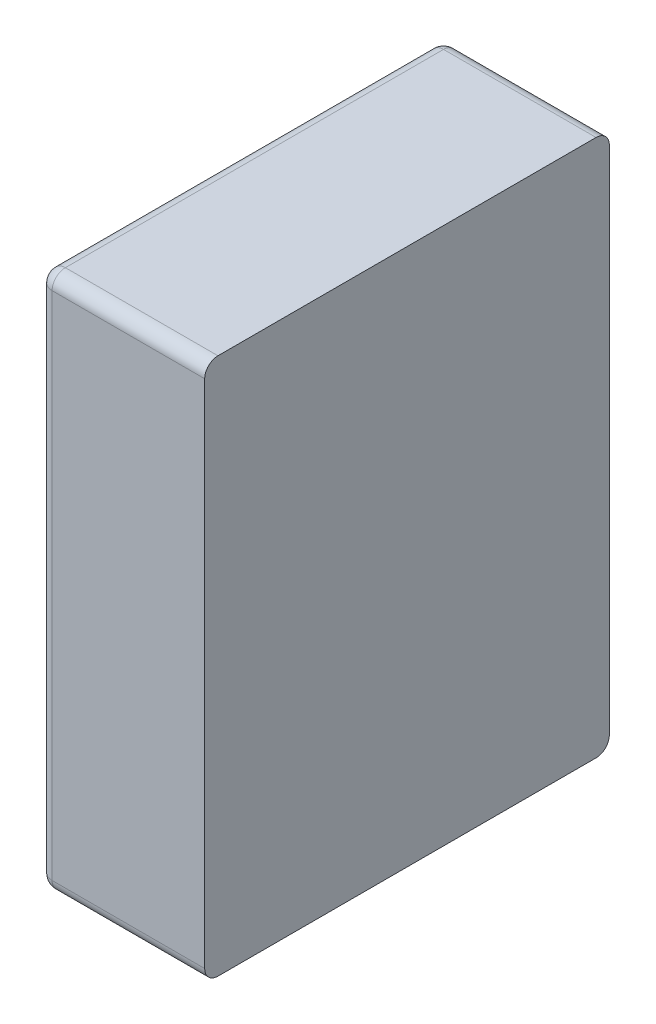
ISO-10303-21;
HEADER;
FILE_DESCRIPTION(('STEP AP214'),'2;1');
FILE_NAME('part.step','',(''),(''),'','','');
FILE_SCHEMA(('AUTOMOTIVE_DESIGN { 1 0 10303 214 1 1 1 1 }'));
ENDSEC;
DATA;
#1=APPLICATION_CONTEXT('core data for automotive mechanical design processes');
#2=APPLICATION_PROTOCOL_DEFINITION('international standard','automotive_design',2000,#1);
#3=PRODUCT_CONTEXT('',#1,'mechanical');
#4=PRODUCT('Part','Part','',(#3));
#5=PRODUCT_RELATED_PRODUCT_CATEGORY('part','',(#4));
#6=PRODUCT_DEFINITION_FORMATION('','',#4);
#7=PRODUCT_DEFINITION_CONTEXT('part definition',#1,'design');
#8=PRODUCT_DEFINITION('design','',#6,#7);
#9=PRODUCT_DEFINITION_SHAPE('','',#8);
#10=(LENGTH_UNIT() NAMED_UNIT(*) SI_UNIT(.MILLI.,.METRE.));
#11=(NAMED_UNIT(*) PLANE_ANGLE_UNIT() SI_UNIT($,.RADIAN.));
#12=(NAMED_UNIT(*) SI_UNIT($,.STERADIAN.) SOLID_ANGLE_UNIT());
#13=UNCERTAINTY_MEASURE_WITH_UNIT(LENGTH_MEASURE(1.E-05),#10,'distance_accuracy_value','');
#14=(GEOMETRIC_REPRESENTATION_CONTEXT(3) GLOBAL_UNCERTAINTY_ASSIGNED_CONTEXT((#13)) GLOBAL_UNIT_ASSIGNED_CONTEXT((#10,
#11,#12)) REPRESENTATION_CONTEXT('',''));
#15=CARTESIAN_POINT('',(0.,0.,0.));
#16=DIRECTION('',(0.,0.,1.));
#17=DIRECTION('',(1.,0.,0.));
#18=AXIS2_PLACEMENT_3D('',#15,#16,#17);
#19=CARTESIAN_POINT('',(-1.56,0.77,1.17));
#20=DIRECTION('',(0.,1.,0.));
#21=DIRECTION('',(1.,0.,0.));
#22=AXIS2_PLACEMENT_3D('',#19,#20,#21);
#23=SPHERICAL_SURFACE('',#22,0.04);
#24=CARTESIAN_POINT('',(-1.56,0.77,1.17));
#25=DIRECTION('',(0.,0.,1.));
#26=DIRECTION('',(0.,1.,0.));
#27=AXIS2_PLACEMENT_3D('',#24,#25,#26);
#28=CIRCLE('',#27,0.04);
#29=CARTESIAN_POINT('',(-1.56,0.81,1.17));
#30=VERTEX_POINT('',#29);
#31=CARTESIAN_POINT('',(-1.6,0.77,1.17));
#32=VERTEX_POINT('',#31);
#33=EDGE_CURVE('E41',#30,#32,#28,.T.);
#34=ORIENTED_EDGE('',*,*,#33,.T.);
#35=CARTESIAN_POINT('',(-1.56,0.77,1.17));
#36=DIRECTION('',(0.,1.,0.));
#37=DIRECTION('',(-1.,0.,0.));
#38=AXIS2_PLACEMENT_3D('',#35,#36,#37);
#39=CIRCLE('',#38,0.04);
#40=CARTESIAN_POINT('',(-1.56,0.77,1.21));
#41=VERTEX_POINT('',#40);
#42=EDGE_CURVE('E224',#32,#41,#39,.T.);
#43=ORIENTED_EDGE('',*,*,#42,.T.);
#44=CARTESIAN_POINT('',(-1.56,0.77,1.17));
#45=DIRECTION('',(-1.,0.,0.));
#46=DIRECTION('',(0.,0.,1.));
#47=AXIS2_PLACEMENT_3D('',#44,#45,#46);
#48=CIRCLE('',#47,0.04);
#49=EDGE_CURVE('E11',#41,#30,#48,.T.);
#50=ORIENTED_EDGE('',*,*,#49,.T.);
#51=EDGE_LOOP('',(#34,#43,#50));
#52=FACE_BOUND('',#51,.T.);
#53=ADVANCED_FACE('F17',(#52),#23,.T.);
#54=CARTESIAN_POINT('',(-1.6,0.77,1.17));
#55=DIRECTION('',(1.,0.,0.));
#56=DIRECTION('',(0.,1.,0.));
#57=AXIS2_PLACEMENT_3D('',#54,#55,#56);
#58=CYLINDRICAL_SURFACE('',#57,0.04);
#59=DIRECTION('',(-1.,0.,0.));
#60=VECTOR('',#59,1.);
#61=CARTESIAN_POINT('',(-1.1,0.81,1.17));
#62=LINE('',#61,#60);
#63=CARTESIAN_POINT('',(-1.1,0.81,1.17));
#64=VERTEX_POINT('',#63);
#65=EDGE_CURVE('E25',#64,#30,#62,.T.);
#66=ORIENTED_EDGE('',*,*,#65,.T.);
#67=ORIENTED_EDGE('',*,*,#49,.F.);
#68=DIRECTION('',(1.,0.,0.));
#69=VECTOR('',#68,1.);
#70=CARTESIAN_POINT('',(-1.56,0.77,1.21));
#71=LINE('',#70,#69);
#72=CARTESIAN_POINT('',(-1.1,0.77,1.21));
#73=VERTEX_POINT('',#72);
#74=EDGE_CURVE('E225',#41,#73,#71,.T.);
#75=ORIENTED_EDGE('',*,*,#74,.T.);
#76=CARTESIAN_POINT('',(-1.1,0.77,1.17));
#77=DIRECTION('',(1.,0.,0.));
#78=DIRECTION('',(0.,1.,0.));
#79=AXIS2_PLACEMENT_3D('',#76,#77,#78);
#80=CIRCLE('',#79,0.04);
#81=EDGE_CURVE('E219',#64,#73,#80,.T.);
#82=ORIENTED_EDGE('',*,*,#81,.F.);
#83=EDGE_LOOP('',(#66,#67,#75,#82));
#84=FACE_BOUND('',#83,.T.);
#85=ADVANCED_FACE('F262',(#84),#58,.T.);
#86=CARTESIAN_POINT('',(-1.6,0.81,1.21));
#87=DIRECTION('',(0.,-1.,0.));
#88=DIRECTION('',(0.,0.,-1.));
#89=AXIS2_PLACEMENT_3D('',#86,#87,#88);
#90=PLANE('',#89);
#91=DIRECTION('',(0.,0.,1.));
#92=VECTOR('',#91,1.);
#93=CARTESIAN_POINT('',(-1.1,0.81,0.03));
#94=LINE('',#93,#92);
#95=CARTESIAN_POINT('',(-1.1,0.81,0.03));
#96=VERTEX_POINT('',#95);
#97=EDGE_CURVE('E215',#96,#64,#94,.T.);
#98=ORIENTED_EDGE('',*,*,#97,.F.);
#99=DIRECTION('',(1.,0.,0.));
#100=VECTOR('',#99,1.);
#101=CARTESIAN_POINT('',(-1.56,0.81,0.03));
#102=LINE('',#101,#100);
#103=CARTESIAN_POINT('',(-1.56,0.81,0.03));
#104=VERTEX_POINT('',#103);
#105=EDGE_CURVE('E203',#104,#96,#102,.T.);
#106=ORIENTED_EDGE('',*,*,#105,.F.);
#107=DIRECTION('',(0.,0.,-1.));
#108=VECTOR('',#107,1.);
#109=CARTESIAN_POINT('',(-1.56,0.81,1.17));
#110=LINE('',#109,#108);
#111=EDGE_CURVE('E254',#30,#104,#110,.T.);
#112=ORIENTED_EDGE('',*,*,#111,.F.);
#113=ORIENTED_EDGE('',*,*,#65,.F.);
#114=EDGE_LOOP('',(#98,#106,#112,#113));
#115=FACE_BOUND('',#114,.T.);
#116=ADVANCED_FACE('F265',(#115),#90,.F.);
#117=CARTESIAN_POINT('',(-1.56,0.77,0.));
#118=DIRECTION('',(0.,0.,1.));
#119=DIRECTION('',(1.,0.,0.));
#120=AXIS2_PLACEMENT_3D('',#117,#118,#119);
#121=CYLINDRICAL_SURFACE('',#120,0.04);
#122=DIRECTION('',(0.,0.,1.));
#123=VECTOR('',#122,1.);
#124=CARTESIAN_POINT('',(-1.6,0.77,0.03));
#125=LINE('',#124,#123);
#126=CARTESIAN_POINT('',(-1.6,0.77,0.03));
#127=VERTEX_POINT('',#126);
#128=EDGE_CURVE('E249',#127,#32,#125,.T.);
#129=ORIENTED_EDGE('',*,*,#128,.T.);
#130=ORIENTED_EDGE('',*,*,#33,.F.);
#131=ORIENTED_EDGE('',*,*,#111,.T.);
#132=CARTESIAN_POINT('',(-1.56,0.77,0.03));
#133=DIRECTION('',(0.,0.,-1.));
#134=DIRECTION('',(-1.,0.,0.));
#135=AXIS2_PLACEMENT_3D('',#132,#133,#134);
#136=CIRCLE('',#135,0.04);
#137=EDGE_CURVE('E183',#127,#104,#136,.T.);
#138=ORIENTED_EDGE('',*,*,#137,.F.);
#139=EDGE_LOOP('',(#129,#130,#131,#138));
#140=FACE_BOUND('',#139,.T.);
#141=ADVANCED_FACE('F269',(#140),#121,.T.);
#142=CARTESIAN_POINT('',(-1.6,0.,0.));
#143=DIRECTION('',(-1.,0.,0.));
#144=DIRECTION('',(0.,0.,1.));
#145=AXIS2_PLACEMENT_3D('',#142,#143,#144);
#146=PLANE('',#145);
#147=DIRECTION('',(0.,0.,-1.));
#148=VECTOR('',#147,1.);
#149=CARTESIAN_POINT('',(-1.6,-0.77,1.17));
#150=LINE('',#149,#148);
#151=CARTESIAN_POINT('',(-1.6,-0.77,1.17));
#152=VERTEX_POINT('',#151);
#153=CARTESIAN_POINT('',(-1.6,-0.77,0.03));
#154=VERTEX_POINT('',#153);
#155=EDGE_CURVE('E142',#152,#154,#150,.T.);
#156=ORIENTED_EDGE('',*,*,#155,.F.);
#157=DIRECTION('',(0.,-1.,0.));
#158=VECTOR('',#157,1.);
#159=CARTESIAN_POINT('',(-1.6,0.77,1.17));
#160=LINE('',#159,#158);
#161=EDGE_CURVE('E246',#32,#152,#160,.T.);
#162=ORIENTED_EDGE('',*,*,#161,.F.);
#163=ORIENTED_EDGE('',*,*,#128,.F.);
#164=DIRECTION('',(0.,1.,0.));
#165=VECTOR('',#164,1.);
#166=CARTESIAN_POINT('',(-1.6,-0.77,0.03));
#167=LINE('',#166,#165);
#168=EDGE_CURVE('E178',#154,#127,#167,.T.);
#169=ORIENTED_EDGE('',*,*,#168,.F.);
#170=EDGE_LOOP('',(#156,#162,#163,#169));
#171=FACE_BOUND('',#170,.T.);
#172=ADVANCED_FACE('F274',(#171),#146,.T.);
#173=CARTESIAN_POINT('',(-1.56,0.,1.17));
#174=DIRECTION('',(0.,-1.,0.));
#175=DIRECTION('',(1.,0.,0.));
#176=AXIS2_PLACEMENT_3D('',#173,#174,#175);
#177=CYLINDRICAL_SURFACE('',#176,0.04);
#178=DIRECTION('',(0.,1.,0.));
#179=VECTOR('',#178,1.);
#180=CARTESIAN_POINT('',(-1.56,-0.77,1.21));
#181=LINE('',#180,#179);
#182=CARTESIAN_POINT('',(-1.56,-0.77,1.21));
#183=VERTEX_POINT('',#182);
#184=EDGE_CURVE('E220',#183,#41,#181,.T.);
#185=ORIENTED_EDGE('',*,*,#184,.T.);
#186=ORIENTED_EDGE('',*,*,#42,.F.);
#187=ORIENTED_EDGE('',*,*,#161,.T.);
#188=CARTESIAN_POINT('',(-1.56,-0.77,1.17));
#189=DIRECTION('',(0.,-1.,0.));
#190=DIRECTION('',(0.,0.,1.));
#191=AXIS2_PLACEMENT_3D('',#188,#189,#190);
#192=CIRCLE('',#191,0.04);
#193=EDGE_CURVE('E149',#183,#152,#192,.T.);
#194=ORIENTED_EDGE('',*,*,#193,.F.);
#195=EDGE_LOOP('',(#185,#186,#187,#194));
#196=FACE_BOUND('',#195,.T.);
#197=ADVANCED_FACE('F276',(#196),#177,.T.);
#198=CARTESIAN_POINT('',(-1.6,-0.81,1.21));
#199=DIRECTION('',(0.,0.,-1.));
#200=DIRECTION('',(0.,-1.,0.));
#201=AXIS2_PLACEMENT_3D('',#198,#199,#200);
#202=PLANE('',#201);
#203=DIRECTION('',(0.,-1.,0.));
#204=VECTOR('',#203,1.);
#205=CARTESIAN_POINT('',(-1.1,0.77,1.21));
#206=LINE('',#205,#204);
#207=CARTESIAN_POINT('',(-1.1,-0.77,1.21));
#208=VERTEX_POINT('',#207);
#209=EDGE_CURVE('E177',#73,#208,#206,.T.);
#210=ORIENTED_EDGE('',*,*,#209,.F.);
#211=ORIENTED_EDGE('',*,*,#74,.F.);
#212=ORIENTED_EDGE('',*,*,#184,.F.);
#213=DIRECTION('',(-1.,0.,0.));
#214=VECTOR('',#213,1.);
#215=CARTESIAN_POINT('',(-1.1,-0.77,1.21));
#216=LINE('',#215,#214);
#217=EDGE_CURVE('E128',#208,#183,#216,.T.);
#218=ORIENTED_EDGE('',*,*,#217,.F.);
#219=EDGE_LOOP('',(#210,#211,#212,#218));
#220=FACE_BOUND('',#219,.T.);
#221=ADVANCED_FACE('F290',(#220),#202,.F.);
#222=CARTESIAN_POINT('',(-1.6,-0.77,1.17));
#223=DIRECTION('',(1.,0.,0.));
#224=DIRECTION('',(0.,1.,0.));
#225=AXIS2_PLACEMENT_3D('',#222,#223,#224);
#226=CYLINDRICAL_SURFACE('',#225,0.04);
#227=ORIENTED_EDGE('',*,*,#217,.T.);
#228=CARTESIAN_POINT('',(-1.56,-0.77,1.17));
#229=DIRECTION('',(-1.,0.,0.));
#230=DIRECTION('',(0.,-1.,0.));
#231=AXIS2_PLACEMENT_3D('',#228,#229,#230);
#232=CIRCLE('',#231,0.04);
#233=CARTESIAN_POINT('',(-1.56,-0.81,1.17));
#234=VERTEX_POINT('',#233);
#235=EDGE_CURVE('E147',#234,#183,#232,.T.);
#236=ORIENTED_EDGE('',*,*,#235,.F.);
#237=DIRECTION('',(1.,0.,0.));
#238=VECTOR('',#237,1.);
#239=CARTESIAN_POINT('',(-1.56,-0.81,1.17));
#240=LINE('',#239,#238);
#241=CARTESIAN_POINT('',(-1.1,-0.81,1.17));
#242=VERTEX_POINT('',#241);
#243=EDGE_CURVE('E117',#234,#242,#240,.T.);
#244=ORIENTED_EDGE('',*,*,#243,.T.);
#245=CARTESIAN_POINT('',(-1.1,-0.77,1.17));
#246=DIRECTION('',(1.,0.,0.));
#247=DIRECTION('',(0.,0.,1.));
#248=AXIS2_PLACEMENT_3D('',#245,#246,#247);
#249=CIRCLE('',#248,0.04);
#250=EDGE_CURVE('E165',#208,#242,#249,.T.);
#251=ORIENTED_EDGE('',*,*,#250,.F.);
#252=EDGE_LOOP('',(#227,#236,#244,#251));
#253=FACE_BOUND('',#252,.T.);
#254=ADVANCED_FACE('F153',(#253),#226,.T.);
#255=CARTESIAN_POINT('',(-1.6,-0.81,-0.01));
#256=DIRECTION('',(0.,1.,0.));
#257=DIRECTION('',(1.,0.,0.));
#258=AXIS2_PLACEMENT_3D('',#255,#256,#257);
#259=PLANE('',#258);
#260=DIRECTION('',(0.,0.,1.));
#261=VECTOR('',#260,1.);
#262=CARTESIAN_POINT('',(-1.56,-0.81,0.03));
#263=LINE('',#262,#261);
#264=CARTESIAN_POINT('',(-1.56,-0.81,0.03));
#265=VERTEX_POINT('',#264);
#266=EDGE_CURVE('E120',#265,#234,#263,.T.);
#267=ORIENTED_EDGE('',*,*,#266,.F.);
#268=DIRECTION('',(-1.,0.,0.));
#269=VECTOR('',#268,1.);
#270=CARTESIAN_POINT('',(-1.1,-0.81,0.03));
#271=LINE('',#270,#269);
#272=CARTESIAN_POINT('',(-1.1,-0.81,0.03));
#273=VERTEX_POINT('',#272);
#274=EDGE_CURVE('E129',#273,#265,#271,.T.);
#275=ORIENTED_EDGE('',*,*,#274,.F.);
#276=DIRECTION('',(0.,0.,-1.));
#277=VECTOR('',#276,1.);
#278=CARTESIAN_POINT('',(-1.1,-0.81,1.17));
#279=LINE('',#278,#277);
#280=EDGE_CURVE('E122',#242,#273,#279,.T.);
#281=ORIENTED_EDGE('',*,*,#280,.F.);
#282=ORIENTED_EDGE('',*,*,#243,.F.);
#283=EDGE_LOOP('',(#267,#275,#281,#282));
#284=FACE_BOUND('',#283,.T.);
#285=ADVANCED_FACE('F119',(#284),#259,.F.);
#286=CARTESIAN_POINT('',(-1.6,-0.77,0.03));
#287=DIRECTION('',(1.,0.,0.));
#288=DIRECTION('',(0.,1.,0.));
#289=AXIS2_PLACEMENT_3D('',#286,#287,#288);
#290=CYLINDRICAL_SURFACE('',#289,0.04);
#291=ORIENTED_EDGE('',*,*,#274,.T.);
#292=CARTESIAN_POINT('',(-1.56,-0.77,0.03));
#293=DIRECTION('',(-1.,0.,0.));
#294=DIRECTION('',(0.,0.,-1.));
#295=AXIS2_PLACEMENT_3D('',#292,#293,#294);
#296=CIRCLE('',#295,0.04);
#297=CARTESIAN_POINT('',(-1.56,-0.77,-0.01));
#298=VERTEX_POINT('',#297);
#299=EDGE_CURVE('E171',#298,#265,#296,.T.);
#300=ORIENTED_EDGE('',*,*,#299,.F.);
#301=DIRECTION('',(1.,0.,0.));
#302=VECTOR('',#301,1.);
#303=CARTESIAN_POINT('',(-1.56,-0.77,-0.01));
#304=LINE('',#303,#302);
#305=CARTESIAN_POINT('',(-1.1,-0.77,-0.01));
#306=VERTEX_POINT('',#305);
#307=EDGE_CURVE('E235',#298,#306,#304,.T.);
#308=ORIENTED_EDGE('',*,*,#307,.T.);
#309=CARTESIAN_POINT('',(-1.1,-0.77,0.03));
#310=DIRECTION('',(1.,0.,0.));
#311=DIRECTION('',(0.,-1.,0.));
#312=AXIS2_PLACEMENT_3D('',#309,#310,#311);
#313=CIRCLE('',#312,0.04);
#314=EDGE_CURVE('E164',#273,#306,#313,.T.);
#315=ORIENTED_EDGE('',*,*,#314,.F.);
#316=EDGE_LOOP('',(#291,#300,#308,#315));
#317=FACE_BOUND('',#316,.T.);
#318=ADVANCED_FACE('F296',(#317),#290,.T.);
#319=CARTESIAN_POINT('',(-1.6,0.81,-0.01));
#320=DIRECTION('',(0.,0.,1.));
#321=DIRECTION('',(1.,0.,0.));
#322=AXIS2_PLACEMENT_3D('',#319,#320,#321);
#323=PLANE('',#322);
#324=DIRECTION('',(0.,-1.,0.));
#325=VECTOR('',#324,1.);
#326=CARTESIAN_POINT('',(-1.56,0.77,-0.01));
#327=LINE('',#326,#325);
#328=CARTESIAN_POINT('',(-1.56,0.77,-0.01));
#329=VERTEX_POINT('',#328);
#330=EDGE_CURVE('E170',#329,#298,#327,.T.);
#331=ORIENTED_EDGE('',*,*,#330,.F.);
#332=DIRECTION('',(-1.,0.,0.));
#333=VECTOR('',#332,1.);
#334=CARTESIAN_POINT('',(-1.1,0.77,-0.01));
#335=LINE('',#334,#333);
#336=CARTESIAN_POINT('',(-1.1,0.77,-0.01));
#337=VERTEX_POINT('',#336);
#338=EDGE_CURVE('E207',#337,#329,#335,.T.);
#339=ORIENTED_EDGE('',*,*,#338,.F.);
#340=DIRECTION('',(0.,1.,0.));
#341=VECTOR('',#340,1.);
#342=CARTESIAN_POINT('',(-1.1,-0.77,-0.01));
#343=LINE('',#342,#341);
#344=EDGE_CURVE('E202',#306,#337,#343,.T.);
#345=ORIENTED_EDGE('',*,*,#344,.F.);
#346=ORIENTED_EDGE('',*,*,#307,.F.);
#347=EDGE_LOOP('',(#331,#339,#345,#346));
#348=FACE_BOUND('',#347,.T.);
#349=ADVANCED_FACE('F301',(#348),#323,.F.);
#350=CARTESIAN_POINT('',(-1.1,0.,0.));
#351=DIRECTION('',(-1.,0.,0.));
#352=DIRECTION('',(0.,0.,1.));
#353=AXIS2_PLACEMENT_3D('',#350,#351,#352);
#354=PLANE('',#353);
#355=ORIENTED_EDGE('',*,*,#344,.T.);
#356=CARTESIAN_POINT('',(-1.1,0.77,0.03));
#357=DIRECTION('',(1.,0.,0.));
#358=DIRECTION('',(0.,0.,-1.));
#359=AXIS2_PLACEMENT_3D('',#356,#357,#358);
#360=CIRCLE('',#359,0.04);
#361=EDGE_CURVE('E198',#337,#96,#360,.T.);
#362=ORIENTED_EDGE('',*,*,#361,.T.);
#363=ORIENTED_EDGE('',*,*,#97,.T.);
#364=ORIENTED_EDGE('',*,*,#81,.T.);
#365=ORIENTED_EDGE('',*,*,#209,.T.);
#366=ORIENTED_EDGE('',*,*,#250,.T.);
#367=ORIENTED_EDGE('',*,*,#280,.T.);
#368=ORIENTED_EDGE('',*,*,#314,.T.);
#369=EDGE_LOOP('',(#355,#362,#363,#364,#365,#366,#367,#368));
#370=FACE_BOUND('',#369,.T.);
#371=ADVANCED_FACE('F307',(#370),#354,.F.);
#372=CARTESIAN_POINT('',(-1.6,0.77,0.03));
#373=DIRECTION('',(1.,0.,0.));
#374=DIRECTION('',(0.,1.,0.));
#375=AXIS2_PLACEMENT_3D('',#372,#373,#374);
#376=CYLINDRICAL_SURFACE('',#375,0.04);
#377=ORIENTED_EDGE('',*,*,#338,.T.);
#378=CARTESIAN_POINT('',(-1.56,0.77,0.03));
#379=DIRECTION('',(-1.,0.,0.));
#380=DIRECTION('',(0.,1.,0.));
#381=AXIS2_PLACEMENT_3D('',#378,#379,#380);
#382=CIRCLE('',#381,0.04);
#383=EDGE_CURVE('E186',#104,#329,#382,.T.);
#384=ORIENTED_EDGE('',*,*,#383,.F.);
#385=ORIENTED_EDGE('',*,*,#105,.T.);
#386=ORIENTED_EDGE('',*,*,#361,.F.);
#387=EDGE_LOOP('',(#377,#384,#385,#386));
#388=FACE_BOUND('',#387,.T.);
#389=ADVANCED_FACE('F315',(#388),#376,.T.);
#390=CARTESIAN_POINT('',(-1.56,0.77,0.03));
#391=DIRECTION('',(0.,1.,0.));
#392=DIRECTION('',(1.,0.,0.));
#393=AXIS2_PLACEMENT_3D('',#390,#391,#392);
#394=SPHERICAL_SURFACE('',#393,0.04);
#395=CARTESIAN_POINT('',(-1.56,0.77,0.03));
#396=DIRECTION('',(0.,1.,0.));
#397=DIRECTION('',(0.,0.,-1.));
#398=AXIS2_PLACEMENT_3D('',#395,#396,#397);
#399=CIRCLE('',#398,0.04);
#400=EDGE_CURVE('E181',#329,#127,#399,.T.);
#401=ORIENTED_EDGE('',*,*,#400,.T.);
#402=ORIENTED_EDGE('',*,*,#137,.T.);
#403=ORIENTED_EDGE('',*,*,#383,.T.);
#404=EDGE_LOOP('',(#401,#402,#403));
#405=FACE_BOUND('',#404,.T.);
#406=ADVANCED_FACE('F311',(#405),#394,.T.);
#407=CARTESIAN_POINT('',(-1.56,0.,0.03));
#408=DIRECTION('',(0.,1.,0.));
#409=DIRECTION('',(-1.,0.,0.));
#410=AXIS2_PLACEMENT_3D('',#407,#408,#409);
#411=CYLINDRICAL_SURFACE('',#410,0.04);
#412=ORIENTED_EDGE('',*,*,#330,.T.);
#413=CARTESIAN_POINT('',(-1.56,-0.77,0.03));
#414=DIRECTION('',(0.,-1.,0.));
#415=DIRECTION('',(-1.,0.,0.));
#416=AXIS2_PLACEMENT_3D('',#413,#414,#415);
#417=CIRCLE('',#416,0.04);
#418=EDGE_CURVE('E166',#154,#298,#417,.T.);
#419=ORIENTED_EDGE('',*,*,#418,.F.);
#420=ORIENTED_EDGE('',*,*,#168,.T.);
#421=ORIENTED_EDGE('',*,*,#400,.F.);
#422=EDGE_LOOP('',(#412,#419,#420,#421));
#423=FACE_BOUND('',#422,.T.);
#424=ADVANCED_FACE('F314',(#423),#411,.T.);
#425=CARTESIAN_POINT('',(-1.56,-0.77,0.03));
#426=DIRECTION('',(0.,1.,0.));
#427=DIRECTION('',(1.,0.,0.));
#428=AXIS2_PLACEMENT_3D('',#425,#426,#427);
#429=SPHERICAL_SURFACE('',#428,0.04);
#430=ORIENTED_EDGE('',*,*,#299,.T.);
#431=CARTESIAN_POINT('',(-1.56,-0.77,0.03));
#432=DIRECTION('',(0.,0.,-1.));
#433=DIRECTION('',(0.,-1.,0.));
#434=AXIS2_PLACEMENT_3D('',#431,#432,#433);
#435=CIRCLE('',#434,0.04);
#436=EDGE_CURVE('E140',#265,#154,#435,.T.);
#437=ORIENTED_EDGE('',*,*,#436,.T.);
#438=ORIENTED_EDGE('',*,*,#418,.T.);
#439=EDGE_LOOP('',(#430,#437,#438));
#440=FACE_BOUND('',#439,.T.);
#441=ADVANCED_FACE('F319',(#440),#429,.T.);
#442=CARTESIAN_POINT('',(-1.56,-0.77,0.));
#443=DIRECTION('',(0.,0.,-1.));
#444=DIRECTION('',(-1.,0.,0.));
#445=AXIS2_PLACEMENT_3D('',#442,#443,#444);
#446=CYLINDRICAL_SURFACE('',#445,0.04);
#447=ORIENTED_EDGE('',*,*,#266,.T.);
#448=CARTESIAN_POINT('',(-1.56,-0.77,1.17));
#449=DIRECTION('',(0.,0.,1.));
#450=DIRECTION('',(-1.,0.,0.));
#451=AXIS2_PLACEMENT_3D('',#448,#449,#450);
#452=CIRCLE('',#451,0.04);
#453=EDGE_CURVE('E137',#152,#234,#452,.T.);
#454=ORIENTED_EDGE('',*,*,#453,.F.);
#455=ORIENTED_EDGE('',*,*,#155,.T.);
#456=ORIENTED_EDGE('',*,*,#436,.F.);
#457=EDGE_LOOP('',(#447,#454,#455,#456));
#458=FACE_BOUND('',#457,.T.);
#459=ADVANCED_FACE('F135',(#458),#446,.T.);
#460=CARTESIAN_POINT('',(-1.56,-0.77,1.17));
#461=DIRECTION('',(0.,1.,0.));
#462=DIRECTION('',(1.,0.,0.));
#463=AXIS2_PLACEMENT_3D('',#460,#461,#462);
#464=SPHERICAL_SURFACE('',#463,0.04);
#465=ORIENTED_EDGE('',*,*,#235,.T.);
#466=ORIENTED_EDGE('',*,*,#193,.T.);
#467=ORIENTED_EDGE('',*,*,#453,.T.);
#468=EDGE_LOOP('',(#465,#466,#467));
#469=FACE_BOUND('',#468,.T.);
#470=ADVANCED_FACE('F146',(#469),#464,.T.);
#471=CLOSED_SHELL('',(#53,#85,#116,#141,#172,#197,#221,#254,#285,#318,#349,#371,#389,#406,#424,
#441,#459,#470));
#472=MANIFOLD_SOLID_BREP('B1',#471);
#473=ADVANCED_BREP_SHAPE_REPRESENTATION('',(#18,#472),#14);
#474=SHAPE_DEFINITION_REPRESENTATION(#9,#473);
ENDSEC;
END-ISO-10303-21;
